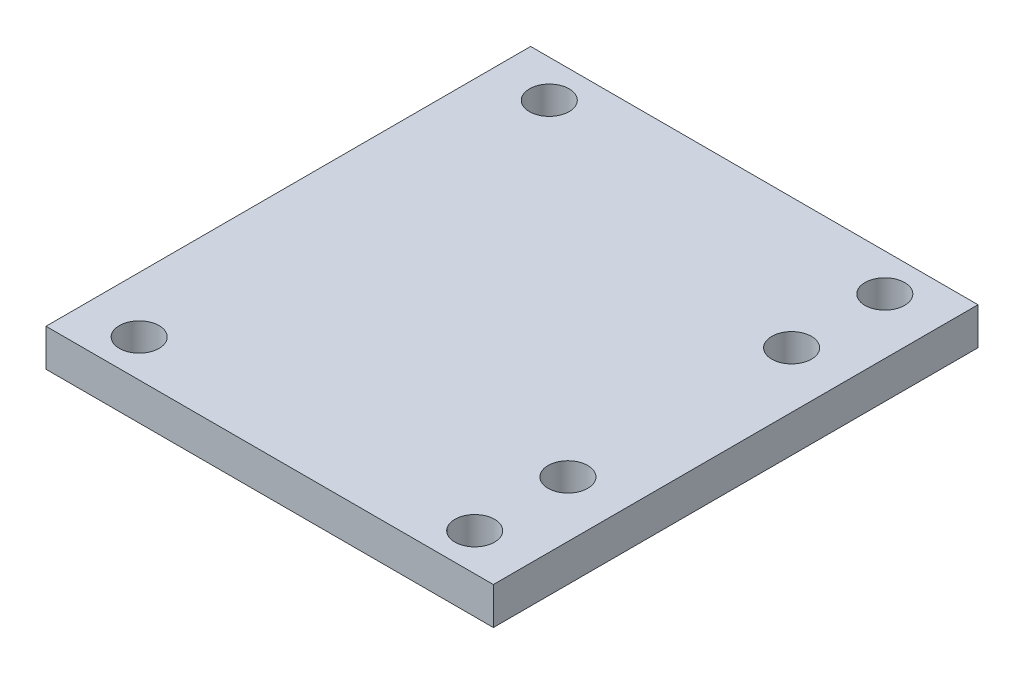
ISO-10303-21;
HEADER;
FILE_DESCRIPTION(('STEP AP214'),'2;1');
FILE_NAME('part.step','',(''),(''),'','','');
FILE_SCHEMA(('AUTOMOTIVE_DESIGN { 1 0 10303 214 1 1 1 1 }'));
ENDSEC;
DATA;
#1=APPLICATION_CONTEXT('core data for automotive mechanical design processes');
#2=APPLICATION_PROTOCOL_DEFINITION('international standard','automotive_design',2000,#1);
#3=PRODUCT_CONTEXT('',#1,'mechanical');
#4=PRODUCT('Part','Part','',(#3));
#5=PRODUCT_RELATED_PRODUCT_CATEGORY('part','',(#4));
#6=PRODUCT_DEFINITION_FORMATION('','',#4);
#7=PRODUCT_DEFINITION_CONTEXT('part definition',#1,'design');
#8=PRODUCT_DEFINITION('design','',#6,#7);
#9=PRODUCT_DEFINITION_SHAPE('','',#8);
#10=(LENGTH_UNIT() NAMED_UNIT(*) SI_UNIT(.MILLI.,.METRE.));
#11=(NAMED_UNIT(*) PLANE_ANGLE_UNIT() SI_UNIT($,.RADIAN.));
#12=(NAMED_UNIT(*) SI_UNIT($,.STERADIAN.) SOLID_ANGLE_UNIT());
#13=UNCERTAINTY_MEASURE_WITH_UNIT(LENGTH_MEASURE(1.E-05),#10,'distance_accuracy_value','');
#14=(GEOMETRIC_REPRESENTATION_CONTEXT(3) GLOBAL_UNCERTAINTY_ASSIGNED_CONTEXT((#13)) GLOBAL_UNIT_ASSIGNED_CONTEXT((#10,
#11,#12)) REPRESENTATION_CONTEXT('',''));
#15=CARTESIAN_POINT('',(0.,0.,0.));
#16=DIRECTION('',(0.,0.,1.));
#17=DIRECTION('',(1.,0.,0.));
#18=AXIS2_PLACEMENT_3D('',#15,#16,#17);
#19=CARTESIAN_POINT('',(38.1,6.35,41.275));
#20=DIRECTION('',(-1.,0.,0.));
#21=DIRECTION('',(0.,0.,1.));
#22=AXIS2_PLACEMENT_3D('',#19,#20,#21);
#23=PLANE('',#22);
#24=DIRECTION('',(0.,0.,-1.));
#25=VECTOR('',#24,1.);
#26=CARTESIAN_POINT('',(38.1,0.,41.275));
#27=LINE('',#26,#25);
#28=CARTESIAN_POINT('',(38.1,0.,41.275));
#29=VERTEX_POINT('',#28);
#30=CARTESIAN_POINT('',(38.1,0.,-41.275));
#31=VERTEX_POINT('',#30);
#32=EDGE_CURVE('E98',#29,#31,#27,.T.);
#33=ORIENTED_EDGE('',*,*,#32,.T.);
#34=DIRECTION('',(0.,-1.,0.));
#35=VECTOR('',#34,1.);
#36=CARTESIAN_POINT('',(38.1,6.35,-41.275));
#37=LINE('',#36,#35);
#38=CARTESIAN_POINT('',(38.1,6.35,-41.275));
#39=VERTEX_POINT('',#38);
#40=EDGE_CURVE('E11',#39,#31,#37,.T.);
#41=ORIENTED_EDGE('',*,*,#40,.F.);
#42=DIRECTION('',(0.,0.,-1.));
#43=VECTOR('',#42,1.);
#44=CARTESIAN_POINT('',(38.1,6.35,41.275));
#45=LINE('',#44,#43);
#46=CARTESIAN_POINT('',(38.1,6.35,41.275));
#47=VERTEX_POINT('',#46);
#48=EDGE_CURVE('E86',#47,#39,#45,.T.);
#49=ORIENTED_EDGE('',*,*,#48,.F.);
#50=DIRECTION('',(0.,-1.,0.));
#51=VECTOR('',#50,1.);
#52=CARTESIAN_POINT('',(38.1,6.35,41.275));
#53=LINE('',#52,#51);
#54=EDGE_CURVE('E94',#47,#29,#53,.T.);
#55=ORIENTED_EDGE('',*,*,#54,.T.);
#56=EDGE_LOOP('',(#33,#41,#49,#55));
#57=FACE_BOUND('',#56,.T.);
#58=ADVANCED_FACE('F35',(#57),#23,.F.);
#59=CARTESIAN_POINT('',(-38.1,6.35,-41.275));
#60=DIRECTION('',(0.,0.,1.));
#61=DIRECTION('',(1.,0.,0.));
#62=AXIS2_PLACEMENT_3D('',#59,#60,#61);
#63=PLANE('',#62);
#64=DIRECTION('',(-1.,0.,0.));
#65=VECTOR('',#64,1.);
#66=CARTESIAN_POINT('',(-38.1,0.,-41.275));
#67=LINE('',#66,#65);
#68=CARTESIAN_POINT('',(-38.1,0.,-41.275));
#69=VERTEX_POINT('',#68);
#70=EDGE_CURVE('E90',#31,#69,#67,.T.);
#71=ORIENTED_EDGE('',*,*,#70,.T.);
#72=DIRECTION('',(0.,-1.,0.));
#73=VECTOR('',#72,1.);
#74=CARTESIAN_POINT('',(-38.1,6.35,-41.275));
#75=LINE('',#74,#73);
#76=CARTESIAN_POINT('',(-38.1,6.35,-41.275));
#77=VERTEX_POINT('',#76);
#78=EDGE_CURVE('E43',#77,#69,#75,.T.);
#79=ORIENTED_EDGE('',*,*,#78,.F.);
#80=DIRECTION('',(-1.,0.,0.));
#81=VECTOR('',#80,1.);
#82=CARTESIAN_POINT('',(-38.1,6.35,-41.275));
#83=LINE('',#82,#81);
#84=EDGE_CURVE('E81',#39,#77,#83,.T.);
#85=ORIENTED_EDGE('',*,*,#84,.F.);
#86=ORIENTED_EDGE('',*,*,#40,.T.);
#87=EDGE_LOOP('',(#71,#79,#85,#86));
#88=FACE_BOUND('',#87,.T.);
#89=ADVANCED_FACE('F89',(#88),#63,.F.);
#90=CARTESIAN_POINT('',(-38.1,6.35,41.275));
#91=DIRECTION('',(1.,0.,0.));
#92=DIRECTION('',(0.,0.,-1.));
#93=AXIS2_PLACEMENT_3D('',#90,#91,#92);
#94=PLANE('',#93);
#95=DIRECTION('',(0.,0.,1.));
#96=VECTOR('',#95,1.);
#97=CARTESIAN_POINT('',(-38.1,0.,41.275));
#98=LINE('',#97,#96);
#99=CARTESIAN_POINT('',(-38.1,0.,41.275));
#100=VERTEX_POINT('',#99);
#101=EDGE_CURVE('E68',#69,#100,#98,.T.);
#102=ORIENTED_EDGE('',*,*,#101,.T.);
#103=DIRECTION('',(0.,-1.,0.));
#104=VECTOR('',#103,1.);
#105=CARTESIAN_POINT('',(-38.1,6.35,41.275));
#106=LINE('',#105,#104);
#107=CARTESIAN_POINT('',(-38.1,6.35,41.275));
#108=VERTEX_POINT('',#107);
#109=EDGE_CURVE('E91',#108,#100,#106,.T.);
#110=ORIENTED_EDGE('',*,*,#109,.F.);
#111=DIRECTION('',(0.,0.,1.));
#112=VECTOR('',#111,1.);
#113=CARTESIAN_POINT('',(-38.1,6.35,41.275));
#114=LINE('',#113,#112);
#115=EDGE_CURVE('E84',#77,#108,#114,.T.);
#116=ORIENTED_EDGE('',*,*,#115,.F.);
#117=ORIENTED_EDGE('',*,*,#78,.T.);
#118=EDGE_LOOP('',(#102,#110,#116,#117));
#119=FACE_BOUND('',#118,.T.);
#120=ADVANCED_FACE('F92',(#119),#94,.F.);
#121=CARTESIAN_POINT('',(-38.1,6.35,41.275));
#122=DIRECTION('',(0.,0.,-1.));
#123=DIRECTION('',(-1.,0.,0.));
#124=AXIS2_PLACEMENT_3D('',#121,#122,#123);
#125=PLANE('',#124);
#126=DIRECTION('',(1.,0.,0.));
#127=VECTOR('',#126,1.);
#128=CARTESIAN_POINT('',(-38.1,0.,41.275));
#129=LINE('',#128,#127);
#130=EDGE_CURVE('E74',#100,#29,#129,.T.);
#131=ORIENTED_EDGE('',*,*,#130,.T.);
#132=ORIENTED_EDGE('',*,*,#54,.F.);
#133=DIRECTION('',(1.,0.,0.));
#134=VECTOR('',#133,1.);
#135=CARTESIAN_POINT('',(-38.1,6.35,41.275));
#136=LINE('',#135,#134);
#137=EDGE_CURVE('E51',#108,#47,#136,.T.);
#138=ORIENTED_EDGE('',*,*,#137,.F.);
#139=ORIENTED_EDGE('',*,*,#109,.T.);
#140=EDGE_LOOP('',(#131,#132,#138,#139));
#141=FACE_BOUND('',#140,.T.);
#142=ADVANCED_FACE('F106',(#141),#125,.F.);
#143=CARTESIAN_POINT('',(0.,6.35,0.));
#144=DIRECTION('',(0.,-1.,0.));
#145=DIRECTION('',(0.,0.,-1.));
#146=AXIS2_PLACEMENT_3D('',#143,#144,#145);
#147=PLANE('',#146);
#148=CARTESIAN_POINT('',(-28.575,6.35,-34.925));
#149=DIRECTION('',(0.,1.,0.));
#150=DIRECTION('',(0.,0.,1.));
#151=AXIS2_PLACEMENT_3D('',#148,#149,#150);
#152=CIRCLE('',#151,3.37819999999999);
#153=CARTESIAN_POINT('',(-28.575,6.35,-31.5468));
#154=VERTEX_POINT('',#153);
#155=EDGE_CURVE('E144',#154,#154,#152,.T.);
#156=ORIENTED_EDGE('',*,*,#155,.F.);
#157=EDGE_LOOP('',(#156));
#158=FACE_BOUND('',#157,.T.);
#159=CARTESIAN_POINT('',(28.575,6.35,-34.925));
#160=DIRECTION('',(0.,1.,0.));
#161=DIRECTION('',(0.,0.,1.));
#162=AXIS2_PLACEMENT_3D('',#159,#160,#161);
#163=CIRCLE('',#162,3.37819999999999);
#164=CARTESIAN_POINT('',(28.575,6.35,-31.5468));
#165=VERTEX_POINT('',#164);
#166=EDGE_CURVE('E138',#165,#165,#163,.T.);
#167=ORIENTED_EDGE('',*,*,#166,.F.);
#168=EDGE_LOOP('',(#167));
#169=FACE_BOUND('',#168,.T.);
#170=CARTESIAN_POINT('',(28.575,6.35,-19.05));
#171=DIRECTION('',(0.,1.,0.));
#172=DIRECTION('',(0.,0.,1.));
#173=AXIS2_PLACEMENT_3D('',#170,#171,#172);
#174=CIRCLE('',#173,3.37819999999999);
#175=CARTESIAN_POINT('',(28.575,6.35,-15.6718));
#176=VERTEX_POINT('',#175);
#177=EDGE_CURVE('E132',#176,#176,#174,.T.);
#178=ORIENTED_EDGE('',*,*,#177,.F.);
#179=EDGE_LOOP('',(#178));
#180=FACE_BOUND('',#179,.T.);
#181=CARTESIAN_POINT('',(28.575,6.35,19.05));
#182=DIRECTION('',(0.,1.,0.));
#183=DIRECTION('',(0.,0.,1.));
#184=AXIS2_PLACEMENT_3D('',#181,#182,#183);
#185=CIRCLE('',#184,3.37819999999999);
#186=CARTESIAN_POINT('',(28.575,6.35,22.4282));
#187=VERTEX_POINT('',#186);
#188=EDGE_CURVE('E126',#187,#187,#185,.T.);
#189=ORIENTED_EDGE('',*,*,#188,.F.);
#190=EDGE_LOOP('',(#189));
#191=FACE_BOUND('',#190,.T.);
#192=CARTESIAN_POINT('',(-28.575,6.35,34.925));
#193=DIRECTION('',(0.,1.,0.));
#194=DIRECTION('',(0.,0.,1.));
#195=AXIS2_PLACEMENT_3D('',#192,#193,#194);
#196=CIRCLE('',#195,3.37819999999999);
#197=CARTESIAN_POINT('',(-28.575,6.35,38.3032));
#198=VERTEX_POINT('',#197);
#199=EDGE_CURVE('E120',#198,#198,#196,.T.);
#200=ORIENTED_EDGE('',*,*,#199,.F.);
#201=EDGE_LOOP('',(#200));
#202=FACE_BOUND('',#201,.T.);
#203=CARTESIAN_POINT('',(28.575,6.35,34.925));
#204=DIRECTION('',(0.,1.,0.));
#205=DIRECTION('',(0.,0.,1.));
#206=AXIS2_PLACEMENT_3D('',#203,#204,#205);
#207=CIRCLE('',#206,3.37819999999999);
#208=CARTESIAN_POINT('',(28.575,6.35,38.3032));
#209=VERTEX_POINT('',#208);
#210=EDGE_CURVE('E114',#209,#209,#207,.T.);
#211=ORIENTED_EDGE('',*,*,#210,.F.);
#212=EDGE_LOOP('',(#211));
#213=FACE_BOUND('',#212,.T.);
#214=ORIENTED_EDGE('',*,*,#48,.T.);
#215=ORIENTED_EDGE('',*,*,#84,.T.);
#216=ORIENTED_EDGE('',*,*,#115,.T.);
#217=ORIENTED_EDGE('',*,*,#137,.T.);
#218=EDGE_LOOP('',(#214,#215,#216,#217));
#219=FACE_BOUND('',#218,.T.);
#220=ADVANCED_FACE('F82',(#158,#169,#180,#191,#202,#213,#219),#147,.F.);
#221=CARTESIAN_POINT('',(0.,0.,0.));
#222=DIRECTION('',(0.,-1.,0.));
#223=DIRECTION('',(0.,0.,-1.));
#224=AXIS2_PLACEMENT_3D('',#221,#222,#223);
#225=PLANE('',#224);
#226=CARTESIAN_POINT('',(-28.575,0.,-34.925));
#227=DIRECTION('',(0.,1.,0.));
#228=DIRECTION('',(0.,0.,1.));
#229=AXIS2_PLACEMENT_3D('',#226,#227,#228);
#230=CIRCLE('',#229,3.3782);
#231=CARTESIAN_POINT('',(-28.575,0.,-31.5468));
#232=VERTEX_POINT('',#231);
#233=EDGE_CURVE('E141',#232,#232,#230,.T.);
#234=ORIENTED_EDGE('',*,*,#233,.T.);
#235=EDGE_LOOP('',(#234));
#236=FACE_BOUND('',#235,.T.);
#237=CARTESIAN_POINT('',(28.575,0.,-34.925));
#238=DIRECTION('',(0.,1.,0.));
#239=DIRECTION('',(0.,0.,1.));
#240=AXIS2_PLACEMENT_3D('',#237,#238,#239);
#241=CIRCLE('',#240,3.37819999999999);
#242=CARTESIAN_POINT('',(28.575,0.,-31.5468));
#243=VERTEX_POINT('',#242);
#244=EDGE_CURVE('E135',#243,#243,#241,.T.);
#245=ORIENTED_EDGE('',*,*,#244,.T.);
#246=EDGE_LOOP('',(#245));
#247=FACE_BOUND('',#246,.T.);
#248=CARTESIAN_POINT('',(28.575,0.,-19.05));
#249=DIRECTION('',(0.,1.,0.));
#250=DIRECTION('',(0.,0.,1.));
#251=AXIS2_PLACEMENT_3D('',#248,#249,#250);
#252=CIRCLE('',#251,3.37819999999999);
#253=CARTESIAN_POINT('',(28.575,0.,-15.6718));
#254=VERTEX_POINT('',#253);
#255=EDGE_CURVE('E129',#254,#254,#252,.T.);
#256=ORIENTED_EDGE('',*,*,#255,.T.);
#257=EDGE_LOOP('',(#256));
#258=FACE_BOUND('',#257,.T.);
#259=CARTESIAN_POINT('',(28.575,0.,19.05));
#260=DIRECTION('',(0.,1.,0.));
#261=DIRECTION('',(0.,0.,1.));
#262=AXIS2_PLACEMENT_3D('',#259,#260,#261);
#263=CIRCLE('',#262,3.37819999999999);
#264=CARTESIAN_POINT('',(28.575,0.,22.4282));
#265=VERTEX_POINT('',#264);
#266=EDGE_CURVE('E123',#265,#265,#263,.T.);
#267=ORIENTED_EDGE('',*,*,#266,.T.);
#268=EDGE_LOOP('',(#267));
#269=FACE_BOUND('',#268,.T.);
#270=CARTESIAN_POINT('',(-28.575,0.,34.925));
#271=DIRECTION('',(0.,1.,0.));
#272=DIRECTION('',(0.,0.,1.));
#273=AXIS2_PLACEMENT_3D('',#270,#271,#272);
#274=CIRCLE('',#273,3.3782);
#275=CARTESIAN_POINT('',(-28.575,0.,38.3032));
#276=VERTEX_POINT('',#275);
#277=EDGE_CURVE('E117',#276,#276,#274,.T.);
#278=ORIENTED_EDGE('',*,*,#277,.T.);
#279=EDGE_LOOP('',(#278));
#280=FACE_BOUND('',#279,.T.);
#281=CARTESIAN_POINT('',(28.575,0.,34.925));
#282=DIRECTION('',(0.,1.,0.));
#283=DIRECTION('',(0.,0.,1.));
#284=AXIS2_PLACEMENT_3D('',#281,#282,#283);
#285=CIRCLE('',#284,3.37819999999999);
#286=CARTESIAN_POINT('',(28.575,0.,38.3032));
#287=VERTEX_POINT('',#286);
#288=EDGE_CURVE('E101',#287,#287,#285,.T.);
#289=ORIENTED_EDGE('',*,*,#288,.T.);
#290=EDGE_LOOP('',(#289));
#291=FACE_BOUND('',#290,.T.);
#292=ORIENTED_EDGE('',*,*,#32,.F.);
#293=ORIENTED_EDGE('',*,*,#130,.F.);
#294=ORIENTED_EDGE('',*,*,#101,.F.);
#295=ORIENTED_EDGE('',*,*,#70,.F.);
#296=EDGE_LOOP('',(#292,#293,#294,#295));
#297=FACE_BOUND('',#296,.T.);
#298=ADVANCED_FACE('F109',(#236,#247,#258,#269,#280,#291,#297),#225,.T.);
#299=CARTESIAN_POINT('',(28.575,6.35,34.925));
#300=DIRECTION('',(0.,1.,0.));
#301=DIRECTION('',(0.,0.,1.));
#302=AXIS2_PLACEMENT_3D('',#299,#300,#301);
#303=CYLINDRICAL_SURFACE('',#302,3.37819999999999);
#304=ORIENTED_EDGE('',*,*,#288,.F.);
#305=EDGE_LOOP('',(#304));
#306=FACE_BOUND('',#305,.T.);
#307=ORIENTED_EDGE('',*,*,#210,.T.);
#308=EDGE_LOOP('',(#307));
#309=FACE_BOUND('',#308,.T.);
#310=ADVANCED_FACE('F163',(#306,#309),#303,.F.);
#311=CARTESIAN_POINT('',(-28.575,6.35,34.925));
#312=DIRECTION('',(0.,1.,0.));
#313=DIRECTION('',(0.,0.,1.));
#314=AXIS2_PLACEMENT_3D('',#311,#312,#313);
#315=CYLINDRICAL_SURFACE('',#314,3.37819999999999);
#316=ORIENTED_EDGE('',*,*,#277,.F.);
#317=EDGE_LOOP('',(#316));
#318=FACE_BOUND('',#317,.T.);
#319=ORIENTED_EDGE('',*,*,#199,.T.);
#320=EDGE_LOOP('',(#319));
#321=FACE_BOUND('',#320,.T.);
#322=ADVANCED_FACE('F165',(#318,#321),#315,.F.);
#323=CARTESIAN_POINT('',(28.575,6.35,19.05));
#324=DIRECTION('',(0.,1.,0.));
#325=DIRECTION('',(0.,0.,1.));
#326=AXIS2_PLACEMENT_3D('',#323,#324,#325);
#327=CYLINDRICAL_SURFACE('',#326,3.37819999999999);
#328=ORIENTED_EDGE('',*,*,#266,.F.);
#329=EDGE_LOOP('',(#328));
#330=FACE_BOUND('',#329,.T.);
#331=ORIENTED_EDGE('',*,*,#188,.T.);
#332=EDGE_LOOP('',(#331));
#333=FACE_BOUND('',#332,.T.);
#334=ADVANCED_FACE('F172',(#330,#333),#327,.F.);
#335=CARTESIAN_POINT('',(28.575,6.35,-19.05));
#336=DIRECTION('',(0.,1.,0.));
#337=DIRECTION('',(0.,0.,1.));
#338=AXIS2_PLACEMENT_3D('',#335,#336,#337);
#339=CYLINDRICAL_SURFACE('',#338,3.37819999999999);
#340=ORIENTED_EDGE('',*,*,#255,.F.);
#341=EDGE_LOOP('',(#340));
#342=FACE_BOUND('',#341,.T.);
#343=ORIENTED_EDGE('',*,*,#177,.T.);
#344=EDGE_LOOP('',(#343));
#345=FACE_BOUND('',#344,.T.);
#346=ADVANCED_FACE('F219',(#342,#345),#339,.F.);
#347=CARTESIAN_POINT('',(28.575,6.35,-34.925));
#348=DIRECTION('',(0.,1.,0.));
#349=DIRECTION('',(0.,0.,1.));
#350=AXIS2_PLACEMENT_3D('',#347,#348,#349);
#351=CYLINDRICAL_SURFACE('',#350,3.37819999999999);
#352=ORIENTED_EDGE('',*,*,#244,.F.);
#353=EDGE_LOOP('',(#352));
#354=FACE_BOUND('',#353,.T.);
#355=ORIENTED_EDGE('',*,*,#166,.T.);
#356=EDGE_LOOP('',(#355));
#357=FACE_BOUND('',#356,.T.);
#358=ADVANCED_FACE('F229',(#354,#357),#351,.F.);
#359=CARTESIAN_POINT('',(-28.575,6.35,-34.925));
#360=DIRECTION('',(0.,1.,0.));
#361=DIRECTION('',(0.,0.,1.));
#362=AXIS2_PLACEMENT_3D('',#359,#360,#361);
#363=CYLINDRICAL_SURFACE('',#362,3.37819999999999);
#364=ORIENTED_EDGE('',*,*,#233,.F.);
#365=EDGE_LOOP('',(#364));
#366=FACE_BOUND('',#365,.T.);
#367=ORIENTED_EDGE('',*,*,#155,.T.);
#368=EDGE_LOOP('',(#367));
#369=FACE_BOUND('',#368,.T.);
#370=ADVANCED_FACE('F148',(#366,#369),#363,.F.);
#371=CLOSED_SHELL('',(#58,#89,#120,#142,#220,#298,#310,#322,#334,#346,#358,#370));
#372=MANIFOLD_SOLID_BREP('B2',#371);
#373=ADVANCED_BREP_SHAPE_REPRESENTATION('',(#18,#372),#14);
#374=SHAPE_DEFINITION_REPRESENTATION(#9,#373);
ENDSEC;
END-ISO-10303-21;
